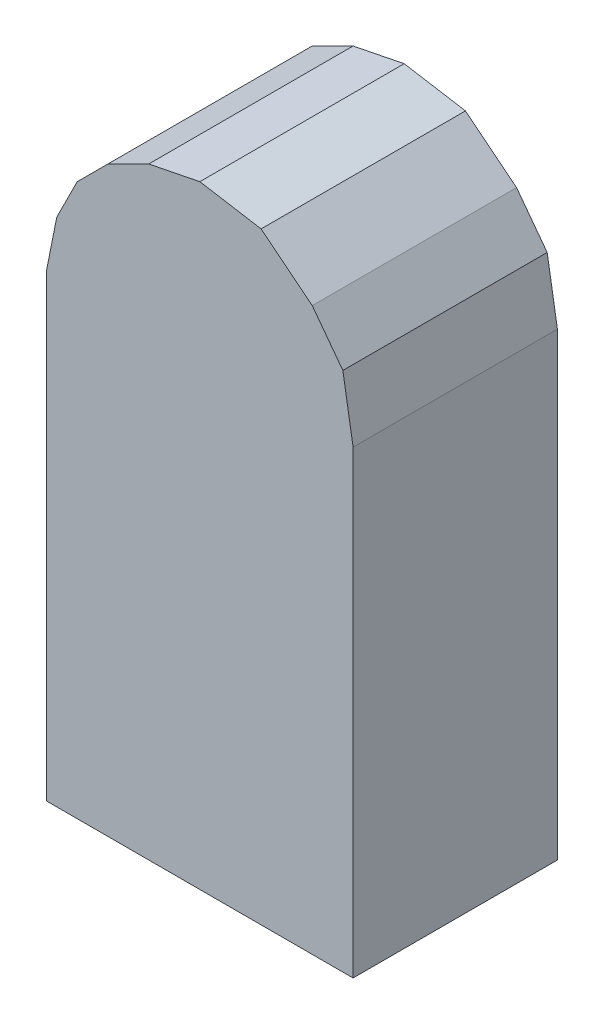
ISO-10303-21;
HEADER;
FILE_DESCRIPTION(('STEP AP214'),'2;1');
FILE_NAME('part.step','',(''),(''),'','','');
FILE_SCHEMA(('AUTOMOTIVE_DESIGN { 1 0 10303 214 1 1 1 1 }'));
ENDSEC;
DATA;
#1=APPLICATION_CONTEXT('core data for automotive mechanical design processes');
#2=APPLICATION_PROTOCOL_DEFINITION('international standard','automotive_design',2000,#1);
#3=PRODUCT_CONTEXT('',#1,'mechanical');
#4=PRODUCT('Part','Part','',(#3));
#5=PRODUCT_RELATED_PRODUCT_CATEGORY('part','',(#4));
#6=PRODUCT_DEFINITION_FORMATION('','',#4);
#7=PRODUCT_DEFINITION_CONTEXT('part definition',#1,'design');
#8=PRODUCT_DEFINITION('design','',#6,#7);
#9=PRODUCT_DEFINITION_SHAPE('','',#8);
#10=(LENGTH_UNIT() NAMED_UNIT(*) SI_UNIT(.MILLI.,.METRE.));
#11=(NAMED_UNIT(*) PLANE_ANGLE_UNIT() SI_UNIT($,.RADIAN.));
#12=(NAMED_UNIT(*) SI_UNIT($,.STERADIAN.) SOLID_ANGLE_UNIT());
#13=UNCERTAINTY_MEASURE_WITH_UNIT(LENGTH_MEASURE(1.E-05),#10,'distance_accuracy_value','');
#14=(GEOMETRIC_REPRESENTATION_CONTEXT(3) GLOBAL_UNCERTAINTY_ASSIGNED_CONTEXT((#13)) GLOBAL_UNIT_ASSIGNED_CONTEXT((#10,
#11,#12)) REPRESENTATION_CONTEXT('',''));
#15=CARTESIAN_POINT('',(0.,0.,0.));
#16=DIRECTION('',(0.,0.,1.));
#17=DIRECTION('',(1.,0.,0.));
#18=AXIS2_PLACEMENT_3D('',#15,#16,#17);
#19=CARTESIAN_POINT('',(0.1499997,-0.2999994,0.2));
#20=DIRECTION('',(0.,0.,-1.));
#21=DIRECTION('',(-1.,0.,0.));
#22=AXIS2_PLACEMENT_3D('',#19,#20,#21);
#23=PLANE('',#22);
#24=DIRECTION('',(0.780868809443225,-0.62469504755418,0.));
#25=VECTOR('',#24,1.);
#26=CARTESIAN_POINT('',(0.10999978,0.2499995,0.2));
#27=LINE('',#26,#25);
#28=CARTESIAN_POINT('',(0.10999978,0.2499995,0.2));
#29=VERTEX_POINT('',#28);
#30=CARTESIAN_POINT('',(0.0599998799999847,0.289999419999994,0.2));
#31=VERTEX_POINT('',#30);
#32=EDGE_CURVE('E20',#29,#31,#27,.F.);
#33=ORIENTED_EDGE('',*,*,#32,.T.);
#34=DIRECTION('',(0.986393923832198,-0.164398987305033,0.));
#35=VECTOR('',#34,1.);
#36=CARTESIAN_POINT('',(0.05999987999999,0.28999942,0.2));
#37=LINE('',#36,#35);
#38=CARTESIAN_POINT('',(0.,0.299999399999993,0.2));
#39=VERTEX_POINT('',#38);
#40=EDGE_CURVE('E169',#31,#39,#37,.F.);
#41=ORIENTED_EDGE('',*,*,#40,.T.);
#42=DIRECTION('',(0.980580675690959,0.196116135137992,0.));
#43=VECTOR('',#42,1.);
#44=CARTESIAN_POINT('',(0.,0.2999994,0.2));
#45=LINE('',#44,#43);
#46=CARTESIAN_POINT('',(-0.0499999000000004,0.289999420000003,0.2));
#47=VERTEX_POINT('',#46);
#48=EDGE_CURVE('E164',#39,#47,#45,.F.);
#49=ORIENTED_EDGE('',*,*,#48,.T.);
#50=DIRECTION('',(0.894427190999916,0.447213595499958,0.));
#51=VECTOR('',#50,1.);
#52=CARTESIAN_POINT('',(-0.0499999,0.28999942,0.2));
#53=LINE('',#52,#51);
#54=CARTESIAN_POINT('',(-0.08999982,0.26999946,0.2));
#55=VERTEX_POINT('',#54);
#56=EDGE_CURVE('E159',#47,#55,#53,.F.);
#57=ORIENTED_EDGE('',*,*,#56,.T.);
#58=DIRECTION('',(0.707106781186548,0.707106781186548,0.));
#59=VECTOR('',#58,1.);
#60=CARTESIAN_POINT('',(-0.08999982,0.26999946,0.2));
#61=LINE('',#60,#59);
#62=CARTESIAN_POINT('',(-0.11999976,0.23999952,0.2));
#63=VERTEX_POINT('',#62);
#64=EDGE_CURVE('E154',#55,#63,#61,.F.);
#65=ORIENTED_EDGE('',*,*,#64,.T.);
#66=DIRECTION('',(0.447213595499958,0.894427190999916,0.));
#67=VECTOR('',#66,1.);
#68=CARTESIAN_POINT('',(-0.11999976,0.23999952,0.2));
#69=LINE('',#68,#67);
#70=CARTESIAN_POINT('',(-0.13999972,0.1999996,0.2));
#71=VERTEX_POINT('',#70);
#72=EDGE_CURVE('E149',#63,#71,#69,.F.);
#73=ORIENTED_EDGE('',*,*,#72,.T.);
#74=DIRECTION('',(0.196116135137992,0.980580675690959,0.));
#75=VECTOR('',#74,1.);
#76=CARTESIAN_POINT('',(-0.13999972,0.1999996,0.2));
#77=LINE('',#76,#75);
#78=CARTESIAN_POINT('',(-0.149999699999998,0.149999699999995,0.2));
#79=VERTEX_POINT('',#78);
#80=EDGE_CURVE('E144',#71,#79,#77,.F.);
#81=ORIENTED_EDGE('',*,*,#80,.T.);
#82=DIRECTION('',(0.,1.,0.));
#83=VECTOR('',#82,1.);
#84=CARTESIAN_POINT('',(-0.1499997,0.1499997,0.2));
#85=LINE('',#84,#83);
#86=CARTESIAN_POINT('',(-0.1499997,-0.2999994,0.2));
#87=VERTEX_POINT('',#86);
#88=EDGE_CURVE('E139',#79,#87,#85,.F.);
#89=ORIENTED_EDGE('',*,*,#88,.T.);
#90=DIRECTION('',(1.,0.,0.));
#91=VECTOR('',#90,1.);
#92=CARTESIAN_POINT('',(-0.1499997,-0.2999994,0.2));
#93=LINE('',#92,#91);
#94=CARTESIAN_POINT('',(0.1499997,-0.2999994,0.2));
#95=VERTEX_POINT('',#94);
#96=EDGE_CURVE('E134',#87,#95,#93,.T.);
#97=ORIENTED_EDGE('',*,*,#96,.T.);
#98=DIRECTION('',(0.,1.,0.));
#99=VECTOR('',#98,1.);
#100=CARTESIAN_POINT('',(0.1499997,-0.2999994,0.2));
#101=LINE('',#100,#99);
#102=CARTESIAN_POINT('',(0.1499997,0.149999700000001,0.2));
#103=VERTEX_POINT('',#102);
#104=EDGE_CURVE('E130',#95,#103,#101,.T.);
#105=ORIENTED_EDGE('',*,*,#104,.T.);
#106=DIRECTION('',(0.164398987305033,-0.986393923832198,0.));
#107=VECTOR('',#106,1.);
#108=CARTESIAN_POINT('',(0.1499997,0.1499997,0.2));
#109=LINE('',#108,#107);
#110=CARTESIAN_POINT('',(0.139999720000007,0.20999958,0.2));
#111=VERTEX_POINT('',#110);
#112=EDGE_CURVE('E117',#103,#111,#109,.F.);
#113=ORIENTED_EDGE('',*,*,#112,.T.);
#114=DIRECTION('',(0.6,-0.8,0.));
#115=VECTOR('',#114,1.);
#116=CARTESIAN_POINT('',(0.13999972,0.20999958,0.2));
#117=LINE('',#116,#115);
#118=EDGE_CURVE('E103',#111,#29,#117,.F.);
#119=ORIENTED_EDGE('',*,*,#118,.T.);
#120=EDGE_LOOP('',(#33,#41,#49,#57,#65,#73,#81,#89,#97,#105,#113,#119));
#121=FACE_BOUND('',#120,.T.);
#122=ADVANCED_FACE('F17',(#121),#23,.F.);
#123=CARTESIAN_POINT('',(0.10999978,0.2499995,0.));
#124=DIRECTION('',(-0.62469504755418,-0.780868809443225,0.));
#125=DIRECTION('',(0.780868809443225,-0.62469504755418,0.));
#126=AXIS2_PLACEMENT_3D('',#123,#124,#125);
#127=PLANE('',#126);
#128=DIRECTION('',(0.,0.,1.));
#129=VECTOR('',#128,1.);
#130=CARTESIAN_POINT('',(0.10999978,0.2499995,0.));
#131=LINE('',#130,#129);
#132=CARTESIAN_POINT('',(0.10999978,0.2499995,0.));
#133=VERTEX_POINT('',#132);
#134=EDGE_CURVE('E109',#29,#133,#131,.F.);
#135=ORIENTED_EDGE('',*,*,#134,.T.);
#136=DIRECTION('',(0.780868809443124,-0.624695047554307,0.));
#137=VECTOR('',#136,1.);
#138=CARTESIAN_POINT('',(0.0599998799999879,0.289999419999997,0.));
#139=LINE('',#138,#137);
#140=CARTESIAN_POINT('',(0.0599998799999848,0.289999419999994,0.));
#141=VERTEX_POINT('',#140);
#142=EDGE_CURVE('E171',#141,#133,#139,.T.);
#143=ORIENTED_EDGE('',*,*,#142,.F.);
#144=DIRECTION('',(0.,0.,1.));
#145=VECTOR('',#144,1.);
#146=CARTESIAN_POINT('',(0.0599998799999883,0.28999942,0.));
#147=LINE('',#146,#145);
#148=EDGE_CURVE('E112',#141,#31,#147,.T.);
#149=ORIENTED_EDGE('',*,*,#148,.T.);
#150=ORIENTED_EDGE('',*,*,#32,.F.);
#151=EDGE_LOOP('',(#135,#143,#149,#150));
#152=FACE_BOUND('',#151,.T.);
#153=ADVANCED_FACE('F108',(#152),#127,.F.);
#154=CARTESIAN_POINT('',(0.13999972,0.20999958,0.));
#155=DIRECTION('',(-0.8,-0.6,0.));
#156=DIRECTION('',(0.6,-0.8,0.));
#157=AXIS2_PLACEMENT_3D('',#154,#155,#156);
#158=PLANE('',#157);
#159=DIRECTION('',(0.,0.,1.));
#160=VECTOR('',#159,1.);
#161=CARTESIAN_POINT('',(0.13999972000002,0.209999580000003,0.));
#162=LINE('',#161,#160);
#163=CARTESIAN_POINT('',(0.139999720000007,0.20999958,0.));
#164=VERTEX_POINT('',#163);
#165=EDGE_CURVE('E119',#111,#164,#162,.F.);
#166=ORIENTED_EDGE('',*,*,#165,.T.);
#167=DIRECTION('',(0.600000000000071,-0.799999999999947,0.));
#168=VECTOR('',#167,1.);
#169=CARTESIAN_POINT('',(0.10999978,0.2499995,0.));
#170=LINE('',#169,#168);
#171=EDGE_CURVE('E123',#133,#164,#170,.T.);
#172=ORIENTED_EDGE('',*,*,#171,.F.);
#173=ORIENTED_EDGE('',*,*,#134,.F.);
#174=ORIENTED_EDGE('',*,*,#118,.F.);
#175=EDGE_LOOP('',(#166,#172,#173,#174));
#176=FACE_BOUND('',#175,.T.);
#177=ADVANCED_FACE('F121',(#176),#158,.F.);
#178=CARTESIAN_POINT('',(0.1499997,0.1499997,0.));
#179=DIRECTION('',(-0.986393923832198,-0.164398987305033,0.));
#180=DIRECTION('',(0.164398987305033,-0.986393923832198,0.));
#181=AXIS2_PLACEMENT_3D('',#178,#179,#180);
#182=PLANE('',#181);
#183=DIRECTION('',(0.,0.,1.));
#184=VECTOR('',#183,1.);
#185=CARTESIAN_POINT('',(0.1499997,0.1499997,0.));
#186=LINE('',#185,#184);
#187=CARTESIAN_POINT('',(0.1499997,0.149999700000001,0.));
#188=VERTEX_POINT('',#187);
#189=EDGE_CURVE('E128',#103,#188,#186,.F.);
#190=ORIENTED_EDGE('',*,*,#189,.T.);
#191=DIRECTION('',(0.164398987305277,-0.986393923832157,0.));
#192=VECTOR('',#191,1.);
#193=CARTESIAN_POINT('',(0.139999720000005,0.209999580000001,0.));
#194=LINE('',#193,#192);
#195=EDGE_CURVE('E174',#164,#188,#194,.T.);
#196=ORIENTED_EDGE('',*,*,#195,.F.);
#197=ORIENTED_EDGE('',*,*,#165,.F.);
#198=ORIENTED_EDGE('',*,*,#112,.F.);
#199=EDGE_LOOP('',(#190,#196,#197,#198));
#200=FACE_BOUND('',#199,.T.);
#201=ADVANCED_FACE('F244',(#200),#182,.F.);
#202=CARTESIAN_POINT('',(0.1499997,-0.2999994,0.));
#203=DIRECTION('',(-1.,0.,0.));
#204=DIRECTION('',(0.,0.,1.));
#205=AXIS2_PLACEMENT_3D('',#202,#203,#204);
#206=PLANE('',#205);
#207=DIRECTION('',(0.,0.,1.));
#208=VECTOR('',#207,1.);
#209=CARTESIAN_POINT('',(0.1499997,-0.2999994,0.));
#210=LINE('',#209,#208);
#211=CARTESIAN_POINT('',(0.1499997,-0.2999994,0.));
#212=VERTEX_POINT('',#211);
#213=EDGE_CURVE('E132',#95,#212,#210,.F.);
#214=ORIENTED_EDGE('',*,*,#213,.T.);
#215=DIRECTION('',(0.,1.,0.));
#216=VECTOR('',#215,1.);
#217=CARTESIAN_POINT('',(0.1499997,-0.2999994,0.));
#218=LINE('',#217,#216);
#219=EDGE_CURVE('E177',#188,#212,#218,.F.);
#220=ORIENTED_EDGE('',*,*,#219,.F.);
#221=ORIENTED_EDGE('',*,*,#189,.F.);
#222=ORIENTED_EDGE('',*,*,#104,.F.);
#223=EDGE_LOOP('',(#214,#220,#221,#222));
#224=FACE_BOUND('',#223,.T.);
#225=ADVANCED_FACE('F240',(#224),#206,.F.);
#226=CARTESIAN_POINT('',(-0.1499997,-0.2999994,0.));
#227=DIRECTION('',(0.,1.,0.));
#228=DIRECTION('',(0.,0.,1.));
#229=AXIS2_PLACEMENT_3D('',#226,#227,#228);
#230=PLANE('',#229);
#231=DIRECTION('',(0.,0.,-1.));
#232=VECTOR('',#231,1.);
#233=CARTESIAN_POINT('',(-0.1499997,-0.2999994,0.));
#234=LINE('',#233,#232);
#235=CARTESIAN_POINT('',(-0.1499997,-0.2999994,0.));
#236=VERTEX_POINT('',#235);
#237=EDGE_CURVE('E137',#87,#236,#234,.T.);
#238=ORIENTED_EDGE('',*,*,#237,.T.);
#239=DIRECTION('',(-1.,0.,0.));
#240=VECTOR('',#239,1.);
#241=CARTESIAN_POINT('',(0.1499997,-0.2999994,0.));
#242=LINE('',#241,#240);
#243=EDGE_CURVE('E180',#212,#236,#242,.T.);
#244=ORIENTED_EDGE('',*,*,#243,.F.);
#245=ORIENTED_EDGE('',*,*,#213,.F.);
#246=ORIENTED_EDGE('',*,*,#96,.F.);
#247=EDGE_LOOP('',(#238,#244,#245,#246));
#248=FACE_BOUND('',#247,.T.);
#249=ADVANCED_FACE('F236',(#248),#230,.F.);
#250=CARTESIAN_POINT('',(-0.1499997,0.1499997,0.));
#251=DIRECTION('',(1.,0.,0.));
#252=DIRECTION('',(0.,0.,-1.));
#253=AXIS2_PLACEMENT_3D('',#250,#251,#252);
#254=PLANE('',#253);
#255=DIRECTION('',(0.,0.,1.));
#256=VECTOR('',#255,1.);
#257=CARTESIAN_POINT('',(-0.14999969999999,0.149999699999998,0.));
#258=LINE('',#257,#256);
#259=CARTESIAN_POINT('',(-0.149999699999998,0.149999699999995,0.));
#260=VERTEX_POINT('',#259);
#261=EDGE_CURVE('E142',#79,#260,#258,.F.);
#262=ORIENTED_EDGE('',*,*,#261,.T.);
#263=DIRECTION('',(0.,1.,0.));
#264=VECTOR('',#263,1.);
#265=CARTESIAN_POINT('',(-0.1499997,-0.2999994,0.));
#266=LINE('',#265,#264);
#267=EDGE_CURVE('E183',#236,#260,#266,.T.);
#268=ORIENTED_EDGE('',*,*,#267,.F.);
#269=ORIENTED_EDGE('',*,*,#237,.F.);
#270=ORIENTED_EDGE('',*,*,#88,.F.);
#271=EDGE_LOOP('',(#262,#268,#269,#270));
#272=FACE_BOUND('',#271,.T.);
#273=ADVANCED_FACE('F232',(#272),#254,.F.);
#274=CARTESIAN_POINT('',(-0.13999972,0.1999996,0.));
#275=DIRECTION('',(0.980580675690959,-0.196116135137992,0.));
#276=DIRECTION('',(0.196116135137992,0.980580675690959,0.));
#277=AXIS2_PLACEMENT_3D('',#274,#275,#276);
#278=PLANE('',#277);
#279=DIRECTION('',(0.,0.,1.));
#280=VECTOR('',#279,1.);
#281=CARTESIAN_POINT('',(-0.13999972,0.1999996,0.));
#282=LINE('',#281,#280);
#283=CARTESIAN_POINT('',(-0.13999972,0.1999996,0.));
#284=VERTEX_POINT('',#283);
#285=EDGE_CURVE('E147',#71,#284,#282,.F.);
#286=ORIENTED_EDGE('',*,*,#285,.T.);
#287=DIRECTION('',(0.196116135138136,0.98058067569093,0.));
#288=VECTOR('',#287,1.);
#289=CARTESIAN_POINT('',(-0.149999699999998,0.1499997,0.));
#290=LINE('',#289,#288);
#291=EDGE_CURVE('E186',#260,#284,#290,.T.);
#292=ORIENTED_EDGE('',*,*,#291,.F.);
#293=ORIENTED_EDGE('',*,*,#261,.F.);
#294=ORIENTED_EDGE('',*,*,#80,.F.);
#295=EDGE_LOOP('',(#286,#292,#293,#294));
#296=FACE_BOUND('',#295,.T.);
#297=ADVANCED_FACE('F228',(#296),#278,.F.);
#298=CARTESIAN_POINT('',(-0.11999976,0.23999952,0.));
#299=DIRECTION('',(0.894427190999916,-0.447213595499958,0.));
#300=DIRECTION('',(0.447213595499958,0.894427190999916,0.));
#301=AXIS2_PLACEMENT_3D('',#298,#299,#300);
#302=PLANE('',#301);
#303=DIRECTION('',(0.,0.,1.));
#304=VECTOR('',#303,1.);
#305=CARTESIAN_POINT('',(-0.11999976,0.23999952,0.));
#306=LINE('',#305,#304);
#307=CARTESIAN_POINT('',(-0.11999976,0.23999952,0.));
#308=VERTEX_POINT('',#307);
#309=EDGE_CURVE('E152',#63,#308,#306,.F.);
#310=ORIENTED_EDGE('',*,*,#309,.T.);
#311=DIRECTION('',(0.447213595499958,0.894427190999916,0.));
#312=VECTOR('',#311,1.);
#313=CARTESIAN_POINT('',(-0.13999972,0.1999996,0.));
#314=LINE('',#313,#312);
#315=EDGE_CURVE('E189',#284,#308,#314,.T.);
#316=ORIENTED_EDGE('',*,*,#315,.F.);
#317=ORIENTED_EDGE('',*,*,#285,.F.);
#318=ORIENTED_EDGE('',*,*,#72,.F.);
#319=EDGE_LOOP('',(#310,#316,#317,#318));
#320=FACE_BOUND('',#319,.T.);
#321=ADVANCED_FACE('F224',(#320),#302,.F.);
#322=CARTESIAN_POINT('',(-0.08999982,0.26999946,0.));
#323=DIRECTION('',(0.707106781186548,-0.707106781186548,0.));
#324=DIRECTION('',(0.707106781186548,0.707106781186548,0.));
#325=AXIS2_PLACEMENT_3D('',#322,#323,#324);
#326=PLANE('',#325);
#327=DIRECTION('',(0.,0.,1.));
#328=VECTOR('',#327,1.);
#329=CARTESIAN_POINT('',(-0.08999982,0.26999946,0.));
#330=LINE('',#329,#328);
#331=CARTESIAN_POINT('',(-0.08999982,0.26999946,0.));
#332=VERTEX_POINT('',#331);
#333=EDGE_CURVE('E157',#55,#332,#330,.F.);
#334=ORIENTED_EDGE('',*,*,#333,.T.);
#335=DIRECTION('',(0.707106781186549,0.707106781186546,0.));
#336=VECTOR('',#335,1.);
#337=CARTESIAN_POINT('',(-0.11999976,0.23999952,0.));
#338=LINE('',#337,#336);
#339=EDGE_CURVE('E192',#308,#332,#338,.T.);
#340=ORIENTED_EDGE('',*,*,#339,.F.);
#341=ORIENTED_EDGE('',*,*,#309,.F.);
#342=ORIENTED_EDGE('',*,*,#64,.F.);
#343=EDGE_LOOP('',(#334,#340,#341,#342));
#344=FACE_BOUND('',#343,.T.);
#345=ADVANCED_FACE('F221',(#344),#326,.F.);
#346=CARTESIAN_POINT('',(-0.0499999,0.28999942,0.));
#347=DIRECTION('',(0.447213595499958,-0.894427190999916,0.));
#348=DIRECTION('',(0.894427190999916,0.447213595499958,0.));
#349=AXIS2_PLACEMENT_3D('',#346,#347,#348);
#350=PLANE('',#349);
#351=DIRECTION('',(0.,0.,1.));
#352=VECTOR('',#351,1.);
#353=CARTESIAN_POINT('',(-0.049999900000002,0.28999942000001,0.));
#354=LINE('',#353,#352);
#355=CARTESIAN_POINT('',(-0.0499999000000004,0.289999420000003,0.));
#356=VERTEX_POINT('',#355);
#357=EDGE_CURVE('E162',#47,#356,#354,.F.);
#358=ORIENTED_EDGE('',*,*,#357,.T.);
#359=DIRECTION('',(0.89442719099989,0.447213595500009,0.));
#360=VECTOR('',#359,1.);
#361=CARTESIAN_POINT('',(-0.08999982,0.26999946,0.));
#362=LINE('',#361,#360);
#363=EDGE_CURVE('E195',#332,#356,#362,.T.);
#364=ORIENTED_EDGE('',*,*,#363,.F.);
#365=ORIENTED_EDGE('',*,*,#333,.F.);
#366=ORIENTED_EDGE('',*,*,#56,.F.);
#367=EDGE_LOOP('',(#358,#364,#365,#366));
#368=FACE_BOUND('',#367,.T.);
#369=ADVANCED_FACE('F205',(#368),#350,.F.);
#370=CARTESIAN_POINT('',(0.,0.2999994,0.));
#371=DIRECTION('',(0.196116135137992,-0.980580675690959,0.));
#372=DIRECTION('',(0.980580675690959,0.196116135137992,0.));
#373=AXIS2_PLACEMENT_3D('',#370,#371,#372);
#374=PLANE('',#373);
#375=DIRECTION('',(0.,0.,1.));
#376=VECTOR('',#375,1.);
#377=CARTESIAN_POINT('',(0.,0.299999399999979,0.));
#378=LINE('',#377,#376);
#379=CARTESIAN_POINT('',(0.,0.299999399999993,0.));
#380=VERTEX_POINT('',#379);
#381=EDGE_CURVE('E35',#39,#380,#378,.F.);
#382=ORIENTED_EDGE('',*,*,#381,.T.);
#383=DIRECTION('',(0.980580675690949,0.196116135138042,0.));
#384=VECTOR('',#383,1.);
#385=CARTESIAN_POINT('',(-0.0499999000000005,0.289999420000003,0.));
#386=LINE('',#385,#384);
#387=EDGE_CURVE('E26',#356,#380,#386,.T.);
#388=ORIENTED_EDGE('',*,*,#387,.F.);
#389=ORIENTED_EDGE('',*,*,#357,.F.);
#390=ORIENTED_EDGE('',*,*,#48,.F.);
#391=EDGE_LOOP('',(#382,#388,#389,#390));
#392=FACE_BOUND('',#391,.T.);
#393=ADVANCED_FACE('F203',(#392),#374,.F.);
#394=CARTESIAN_POINT('',(0.05999987999999,0.28999942,0.));
#395=DIRECTION('',(-0.164398987305033,-0.986393923832198,0.));
#396=DIRECTION('',(0.986393923832198,-0.164398987305033,0.));
#397=AXIS2_PLACEMENT_3D('',#394,#395,#396);
#398=PLANE('',#397);
#399=ORIENTED_EDGE('',*,*,#148,.F.);
#400=DIRECTION('',(0.986393923832146,-0.164398987305343,0.));
#401=VECTOR('',#400,1.);
#402=CARTESIAN_POINT('',(0.,0.299999399999995,0.));
#403=LINE('',#402,#401);
#404=EDGE_CURVE('E11',#380,#141,#403,.T.);
#405=ORIENTED_EDGE('',*,*,#404,.F.);
#406=ORIENTED_EDGE('',*,*,#381,.F.);
#407=ORIENTED_EDGE('',*,*,#40,.F.);
#408=EDGE_LOOP('',(#399,#405,#406,#407));
#409=FACE_BOUND('',#408,.T.);
#410=ADVANCED_FACE('F208',(#409),#398,.F.);
#411=CARTESIAN_POINT('',(0.1499997,-0.2999994,0.));
#412=DIRECTION('',(0.,0.,-1.));
#413=DIRECTION('',(-1.,0.,0.));
#414=AXIS2_PLACEMENT_3D('',#411,#412,#413);
#415=PLANE('',#414);
#416=ORIENTED_EDGE('',*,*,#387,.T.);
#417=ORIENTED_EDGE('',*,*,#404,.T.);
#418=ORIENTED_EDGE('',*,*,#142,.T.);
#419=ORIENTED_EDGE('',*,*,#171,.T.);
#420=ORIENTED_EDGE('',*,*,#195,.T.);
#421=ORIENTED_EDGE('',*,*,#219,.T.);
#422=ORIENTED_EDGE('',*,*,#243,.T.);
#423=ORIENTED_EDGE('',*,*,#267,.T.);
#424=ORIENTED_EDGE('',*,*,#291,.T.);
#425=ORIENTED_EDGE('',*,*,#315,.T.);
#426=ORIENTED_EDGE('',*,*,#339,.T.);
#427=ORIENTED_EDGE('',*,*,#363,.T.);
#428=EDGE_LOOP('',(#416,#417,#418,#419,#420,#421,#422,#423,#424,#425,#426,#427));
#429=FACE_BOUND('',#428,.T.);
#430=ADVANCED_FACE('F200',(#429),#415,.T.);
#431=CLOSED_SHELL('',(#122,#153,#177,#201,#225,#249,#273,#297,#321,#345,#369,#393,#410,#430));
#432=MANIFOLD_SOLID_BREP('B1',#431);
#433=ADVANCED_BREP_SHAPE_REPRESENTATION('',(#18,#432),#14);
#434=SHAPE_DEFINITION_REPRESENTATION(#9,#433);
ENDSEC;
END-ISO-10303-21;
